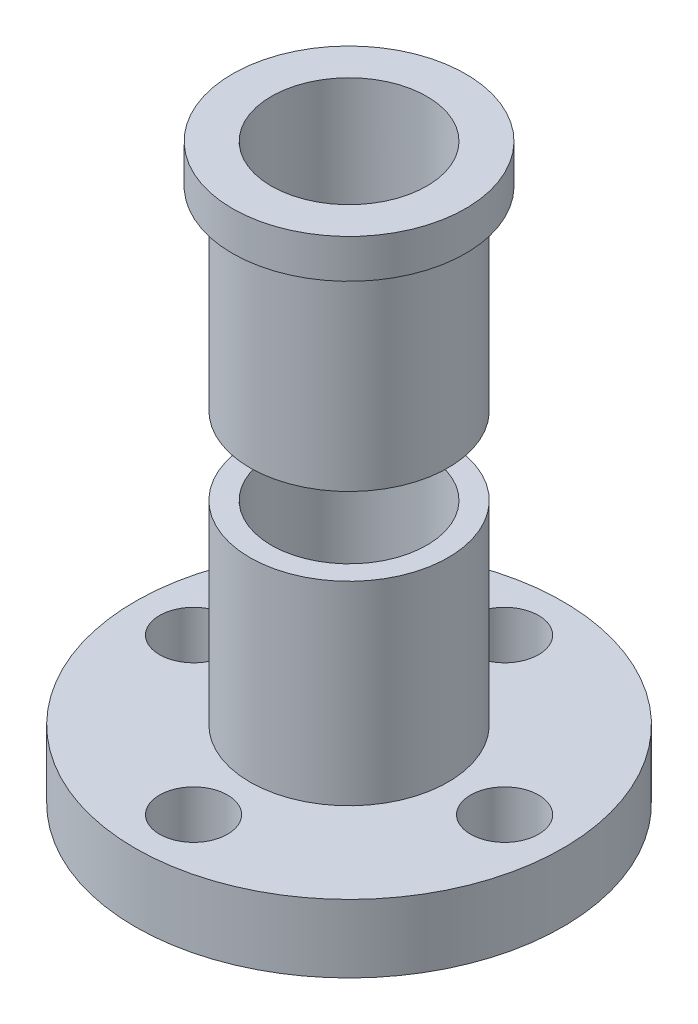
ISO-10303-21;
HEADER;
FILE_DESCRIPTION(('STEP AP214'),'2;1');
FILE_NAME('part.step','',(''),(''),'','','');
FILE_SCHEMA(('AUTOMOTIVE_DESIGN { 1 0 10303 214 1 1 1 1 }'));
ENDSEC;
DATA;
#1=APPLICATION_CONTEXT('core data for automotive mechanical design processes');
#2=APPLICATION_PROTOCOL_DEFINITION('international standard','automotive_design',2000,#1);
#3=PRODUCT_CONTEXT('',#1,'mechanical');
#4=PRODUCT('Part','Part','',(#3));
#5=PRODUCT_RELATED_PRODUCT_CATEGORY('part','',(#4));
#6=PRODUCT_DEFINITION_FORMATION('','',#4);
#7=PRODUCT_DEFINITION_CONTEXT('part definition',#1,'design');
#8=PRODUCT_DEFINITION('design','',#6,#7);
#9=PRODUCT_DEFINITION_SHAPE('','',#8);
#10=(LENGTH_UNIT() NAMED_UNIT(*) SI_UNIT(.MILLI.,.METRE.));
#11=(NAMED_UNIT(*) PLANE_ANGLE_UNIT() SI_UNIT($,.RADIAN.));
#12=(NAMED_UNIT(*) SI_UNIT($,.STERADIAN.) SOLID_ANGLE_UNIT());
#13=UNCERTAINTY_MEASURE_WITH_UNIT(LENGTH_MEASURE(1.E-05),#10,'distance_accuracy_value','');
#14=(GEOMETRIC_REPRESENTATION_CONTEXT(3) GLOBAL_UNCERTAINTY_ASSIGNED_CONTEXT((#13)) GLOBAL_UNIT_ASSIGNED_CONTEXT((#10,
#11,#12)) REPRESENTATION_CONTEXT('',''));
#15=CARTESIAN_POINT('',(0.,0.,0.));
#16=DIRECTION('',(0.,0.,1.));
#17=DIRECTION('',(1.,0.,0.));
#18=AXIS2_PLACEMENT_3D('',#15,#16,#17);
#19=CARTESIAN_POINT('',(0.,15.,0.));
#20=DIRECTION('',(0.,-1.,0.));
#21=DIRECTION('',(0.,0.,-1.));
#22=AXIS2_PLACEMENT_3D('',#19,#20,#21);
#23=CYLINDRICAL_SURFACE('',#22,11.);
#24=CARTESIAN_POINT('',(0.,1.5,0.));
#25=DIRECTION('',(0.,1.,0.));
#26=DIRECTION('',(0.,0.,1.));
#27=AXIS2_PLACEMENT_3D('',#24,#25,#26);
#28=CIRCLE('',#27,11.);
#29=CARTESIAN_POINT('',(0.,1.5,11.));
#30=VERTEX_POINT('',#29);
#31=EDGE_CURVE('P0_E27',#30,#30,#28,.T.);
#32=ORIENTED_EDGE('',*,*,#31,.T.);
#33=EDGE_LOOP('',(#32));
#34=FACE_BOUND('',#33,.T.);
#35=CARTESIAN_POINT('',(0.,5.,0.));
#36=DIRECTION('',(0.,1.,0.));
#37=DIRECTION('',(0.,0.,1.));
#38=AXIS2_PLACEMENT_3D('',#35,#36,#37);
#39=CIRCLE('',#38,11.);
#40=CARTESIAN_POINT('',(0.,5.,11.));
#41=VERTEX_POINT('',#40);
#42=EDGE_CURVE('P0_E18',#41,#41,#39,.T.);
#43=ORIENTED_EDGE('',*,*,#42,.F.);
#44=EDGE_LOOP('',(#43));
#45=FACE_BOUND('',#44,.T.);
#46=ADVANCED_FACE('P0_F15',(#34,#45),#23,.T.);
#47=CARTESIAN_POINT('',(0.,15.,0.));
#48=DIRECTION('',(0.,1.,0.));
#49=DIRECTION('',(0.,0.,1.));
#50=AXIS2_PLACEMENT_3D('',#47,#48,#49);
#51=PLANE('',#50);
#52=CARTESIAN_POINT('',(0.,15.,0.));
#53=DIRECTION('',(0.,1.,0.));
#54=DIRECTION('',(0.,0.,1.));
#55=AXIS2_PLACEMENT_3D('',#52,#53,#54);
#56=CIRCLE('',#55,5.1);
#57=CARTESIAN_POINT('',(0.,15.,5.1));
#58=VERTEX_POINT('',#57);
#59=EDGE_CURVE('P0_E44',#58,#58,#56,.T.);
#60=ORIENTED_EDGE('',*,*,#59,.T.);
#61=EDGE_LOOP('',(#60));
#62=FACE_BOUND('',#61,.T.);
#63=CARTESIAN_POINT('',(0.,15.,0.));
#64=DIRECTION('',(0.,1.,0.));
#65=DIRECTION('',(0.,0.,1.));
#66=AXIS2_PLACEMENT_3D('',#63,#64,#65);
#67=CIRCLE('',#66,4.);
#68=CARTESIAN_POINT('',(0.,15.,4.));
#69=VERTEX_POINT('',#68);
#70=EDGE_CURVE('P0_E10',#69,#69,#67,.T.);
#71=ORIENTED_EDGE('',*,*,#70,.F.);
#72=EDGE_LOOP('',(#71));
#73=FACE_BOUND('',#72,.T.);
#74=ADVANCED_FACE('P0_F93',(#62,#73),#51,.T.);
#75=CARTESIAN_POINT('',(0.,0.,0.));
#76=DIRECTION('',(0.,1.,0.));
#77=DIRECTION('',(0.,0.,1.));
#78=AXIS2_PLACEMENT_3D('',#75,#76,#77);
#79=PLANE('',#78);
#80=CARTESIAN_POINT('',(0.,0.,0.));
#81=DIRECTION('',(0.,1.,0.));
#82=DIRECTION('',(0.,0.,1.));
#83=AXIS2_PLACEMENT_3D('',#80,#81,#82);
#84=CIRCLE('',#83,5.1);
#85=CARTESIAN_POINT('',(0.,0.,5.1));
#86=VERTEX_POINT('',#85);
#87=EDGE_CURVE('P0_E30',#86,#86,#84,.T.);
#88=ORIENTED_EDGE('',*,*,#87,.F.);
#89=EDGE_LOOP('',(#88));
#90=FACE_BOUND('',#89,.T.);
#91=CARTESIAN_POINT('',(0.,0.,0.));
#92=DIRECTION('',(0.,1.,0.));
#93=DIRECTION('',(0.,0.,1.));
#94=AXIS2_PLACEMENT_3D('',#91,#92,#93);
#95=CIRCLE('',#94,4.);
#96=CARTESIAN_POINT('',(0.,0.,4.));
#97=VERTEX_POINT('',#96);
#98=EDGE_CURVE('P0_E22',#97,#97,#95,.T.);
#99=ORIENTED_EDGE('',*,*,#98,.T.);
#100=EDGE_LOOP('',(#99));
#101=FACE_BOUND('',#100,.T.);
#102=ADVANCED_FACE('P0_F98',(#90,#101),#79,.F.);
#103=CARTESIAN_POINT('',(0.,15.,0.));
#104=DIRECTION('',(0.,-1.,0.));
#105=DIRECTION('',(0.,0.,-1.));
#106=AXIS2_PLACEMENT_3D('',#103,#104,#105);
#107=CYLINDRICAL_SURFACE('',#106,4.);
#108=ORIENTED_EDGE('',*,*,#70,.T.);
#109=EDGE_LOOP('',(#108));
#110=FACE_BOUND('',#109,.T.);
#111=ORIENTED_EDGE('',*,*,#98,.F.);
#112=EDGE_LOOP('',(#111));
#113=FACE_BOUND('',#112,.T.);
#114=ADVANCED_FACE('P0_F104',(#110,#113),#107,.F.);
#115=CARTESIAN_POINT('',(0.,1.5,0.));
#116=DIRECTION('',(0.,1.,0.));
#117=DIRECTION('',(0.,0.,1.));
#118=AXIS2_PLACEMENT_3D('',#115,#116,#117);
#119=PLANE('',#118);
#120=CARTESIAN_POINT('',(0.,1.5,-8.));
#121=DIRECTION('',(0.,1.,0.));
#122=DIRECTION('',(0.,0.,1.));
#123=AXIS2_PLACEMENT_3D('',#120,#121,#122);
#124=CIRCLE('',#123,1.75);
#125=CARTESIAN_POINT('',(0.,1.5,-6.25));
#126=VERTEX_POINT('',#125);
#127=EDGE_CURVE('P0_E65',#126,#126,#124,.T.);
#128=ORIENTED_EDGE('',*,*,#127,.T.);
#129=EDGE_LOOP('',(#128));
#130=FACE_BOUND('',#129,.T.);
#131=CARTESIAN_POINT('',(8.,1.5,0.));
#132=DIRECTION('',(0.,1.,0.));
#133=DIRECTION('',(0.,0.,1.));
#134=AXIS2_PLACEMENT_3D('',#131,#132,#133);
#135=CIRCLE('',#134,1.75);
#136=CARTESIAN_POINT('',(8.,1.5,1.75));
#137=VERTEX_POINT('',#136);
#138=EDGE_CURVE('P0_E59',#137,#137,#135,.T.);
#139=ORIENTED_EDGE('',*,*,#138,.T.);
#140=EDGE_LOOP('',(#139));
#141=FACE_BOUND('',#140,.T.);
#142=CARTESIAN_POINT('',(0.,1.5,8.));
#143=DIRECTION('',(0.,1.,0.));
#144=DIRECTION('',(0.,0.,1.));
#145=AXIS2_PLACEMENT_3D('',#142,#143,#144);
#146=CIRCLE('',#145,1.75);
#147=CARTESIAN_POINT('',(0.,1.5,9.75));
#148=VERTEX_POINT('',#147);
#149=EDGE_CURVE('P0_E53',#148,#148,#146,.T.);
#150=ORIENTED_EDGE('',*,*,#149,.T.);
#151=EDGE_LOOP('',(#150));
#152=FACE_BOUND('',#151,.T.);
#153=CARTESIAN_POINT('',(-8.,1.5,0.));
#154=DIRECTION('',(0.,1.,0.));
#155=DIRECTION('',(0.,0.,1.));
#156=AXIS2_PLACEMENT_3D('',#153,#154,#155);
#157=CIRCLE('',#156,1.75);
#158=CARTESIAN_POINT('',(-8.,1.5,1.75));
#159=VERTEX_POINT('',#158);
#160=EDGE_CURVE('P0_E45',#159,#159,#157,.T.);
#161=ORIENTED_EDGE('',*,*,#160,.T.);
#162=EDGE_LOOP('',(#161));
#163=FACE_BOUND('',#162,.T.);
#164=CARTESIAN_POINT('',(0.,1.5,0.));
#165=DIRECTION('',(0.,1.,0.));
#166=DIRECTION('',(0.,0.,1.));
#167=AXIS2_PLACEMENT_3D('',#164,#165,#166);
#168=CIRCLE('',#167,5.1);
#169=CARTESIAN_POINT('',(0.,1.5,5.1));
#170=VERTEX_POINT('',#169);
#171=EDGE_CURVE('P0_E33',#170,#170,#168,.T.);
#172=ORIENTED_EDGE('',*,*,#171,.T.);
#173=EDGE_LOOP('',(#172));
#174=FACE_BOUND('',#173,.T.);
#175=ORIENTED_EDGE('',*,*,#31,.F.);
#176=EDGE_LOOP('',(#175));
#177=FACE_BOUND('',#176,.T.);
#178=ADVANCED_FACE('P0_F110',(#130,#141,#152,#163,#174,#177),#119,.F.);
#179=CARTESIAN_POINT('',(0.,1.5,0.));
#180=DIRECTION('',(0.,-1.,0.));
#181=DIRECTION('',(0.,0.,-1.));
#182=AXIS2_PLACEMENT_3D('',#179,#180,#181);
#183=CYLINDRICAL_SURFACE('',#182,5.1);
#184=ORIENTED_EDGE('',*,*,#171,.F.);
#185=EDGE_LOOP('',(#184));
#186=FACE_BOUND('',#185,.T.);
#187=ORIENTED_EDGE('',*,*,#87,.T.);
#188=EDGE_LOOP('',(#187));
#189=FACE_BOUND('',#188,.T.);
#190=ADVANCED_FACE('P0_F79',(#186,#189),#183,.T.);
#191=CARTESIAN_POINT('',(0.,5.,0.));
#192=DIRECTION('',(0.,1.,0.));
#193=DIRECTION('',(0.,0.,1.));
#194=AXIS2_PLACEMENT_3D('',#191,#192,#193);
#195=PLANE('',#194);
#196=CARTESIAN_POINT('',(0.,5.,-8.));
#197=DIRECTION('',(0.,1.,0.));
#198=DIRECTION('',(0.,0.,1.));
#199=AXIS2_PLACEMENT_3D('',#196,#197,#198);
#200=CIRCLE('',#199,1.75);
#201=CARTESIAN_POINT('',(0.,5.,-6.25));
#202=VERTEX_POINT('',#201);
#203=EDGE_CURVE('P0_E68',#202,#202,#200,.T.);
#204=ORIENTED_EDGE('',*,*,#203,.F.);
#205=EDGE_LOOP('',(#204));
#206=FACE_BOUND('',#205,.T.);
#207=CARTESIAN_POINT('',(8.,5.,0.));
#208=DIRECTION('',(0.,1.,0.));
#209=DIRECTION('',(0.,0.,1.));
#210=AXIS2_PLACEMENT_3D('',#207,#208,#209);
#211=CIRCLE('',#210,1.75);
#212=CARTESIAN_POINT('',(8.,5.,1.75));
#213=VERTEX_POINT('',#212);
#214=EDGE_CURVE('P0_E62',#213,#213,#211,.T.);
#215=ORIENTED_EDGE('',*,*,#214,.F.);
#216=EDGE_LOOP('',(#215));
#217=FACE_BOUND('',#216,.T.);
#218=CARTESIAN_POINT('',(0.,5.,8.));
#219=DIRECTION('',(0.,1.,0.));
#220=DIRECTION('',(0.,0.,1.));
#221=AXIS2_PLACEMENT_3D('',#218,#219,#220);
#222=CIRCLE('',#221,1.75);
#223=CARTESIAN_POINT('',(0.,5.,9.75));
#224=VERTEX_POINT('',#223);
#225=EDGE_CURVE('P0_E56',#224,#224,#222,.T.);
#226=ORIENTED_EDGE('',*,*,#225,.F.);
#227=EDGE_LOOP('',(#226));
#228=FACE_BOUND('',#227,.T.);
#229=CARTESIAN_POINT('',(-8.,5.,0.));
#230=DIRECTION('',(0.,1.,0.));
#231=DIRECTION('',(0.,0.,1.));
#232=AXIS2_PLACEMENT_3D('',#229,#230,#231);
#233=CIRCLE('',#232,1.75);
#234=CARTESIAN_POINT('',(-8.,5.,1.75));
#235=VERTEX_POINT('',#234);
#236=EDGE_CURVE('P0_E50',#235,#235,#233,.T.);
#237=ORIENTED_EDGE('',*,*,#236,.F.);
#238=EDGE_LOOP('',(#237));
#239=FACE_BOUND('',#238,.T.);
#240=CARTESIAN_POINT('',(0.,5.,0.));
#241=DIRECTION('',(0.,1.,0.));
#242=DIRECTION('',(0.,0.,1.));
#243=AXIS2_PLACEMENT_3D('',#240,#241,#242);
#244=CIRCLE('',#243,5.1);
#245=CARTESIAN_POINT('',(0.,5.,5.1));
#246=VERTEX_POINT('',#245);
#247=EDGE_CURVE('P0_E41',#246,#246,#244,.T.);
#248=ORIENTED_EDGE('',*,*,#247,.F.);
#249=EDGE_LOOP('',(#248));
#250=FACE_BOUND('',#249,.T.);
#251=ORIENTED_EDGE('',*,*,#42,.T.);
#252=EDGE_LOOP('',(#251));
#253=FACE_BOUND('',#252,.T.);
#254=ADVANCED_FACE('P0_F75',(#206,#217,#228,#239,#250,#253),#195,.T.);
#255=CARTESIAN_POINT('',(0.,15.,0.));
#256=DIRECTION('',(0.,-1.,0.));
#257=DIRECTION('',(0.,0.,-1.));
#258=AXIS2_PLACEMENT_3D('',#255,#256,#257);
#259=CYLINDRICAL_SURFACE('',#258,5.1);
#260=ORIENTED_EDGE('',*,*,#59,.F.);
#261=EDGE_LOOP('',(#260));
#262=FACE_BOUND('',#261,.T.);
#263=ORIENTED_EDGE('',*,*,#247,.T.);
#264=EDGE_LOOP('',(#263));
#265=FACE_BOUND('',#264,.T.);
#266=ADVANCED_FACE('P0_F78',(#262,#265),#259,.T.);
#267=CARTESIAN_POINT('',(-8.,5.,0.));
#268=DIRECTION('',(0.,1.,0.));
#269=DIRECTION('',(0.,0.,1.));
#270=AXIS2_PLACEMENT_3D('',#267,#268,#269);
#271=CYLINDRICAL_SURFACE('',#270,1.75);
#272=ORIENTED_EDGE('',*,*,#236,.T.);
#273=EDGE_LOOP('',(#272));
#274=FACE_BOUND('',#273,.T.);
#275=ORIENTED_EDGE('',*,*,#160,.F.);
#276=EDGE_LOOP('',(#275));
#277=FACE_BOUND('',#276,.T.);
#278=ADVANCED_FACE('P0_F119',(#274,#277),#271,.F.);
#279=CARTESIAN_POINT('',(0.,5.,8.));
#280=DIRECTION('',(0.,1.,0.));
#281=DIRECTION('',(0.,0.,1.));
#282=AXIS2_PLACEMENT_3D('',#279,#280,#281);
#283=CYLINDRICAL_SURFACE('',#282,1.75);
#284=ORIENTED_EDGE('',*,*,#225,.T.);
#285=EDGE_LOOP('',(#284));
#286=FACE_BOUND('',#285,.T.);
#287=ORIENTED_EDGE('',*,*,#149,.F.);
#288=EDGE_LOOP('',(#287));
#289=FACE_BOUND('',#288,.T.);
#290=ADVANCED_FACE('P0_F123',(#286,#289),#283,.F.);
#291=CARTESIAN_POINT('',(8.,5.,0.));
#292=DIRECTION('',(0.,1.,0.));
#293=DIRECTION('',(0.,0.,1.));
#294=AXIS2_PLACEMENT_3D('',#291,#292,#293);
#295=CYLINDRICAL_SURFACE('',#294,1.75);
#296=ORIENTED_EDGE('',*,*,#214,.T.);
#297=EDGE_LOOP('',(#296));
#298=FACE_BOUND('',#297,.T.);
#299=ORIENTED_EDGE('',*,*,#138,.F.);
#300=EDGE_LOOP('',(#299));
#301=FACE_BOUND('',#300,.T.);
#302=ADVANCED_FACE('P0_F127',(#298,#301),#295,.F.);
#303=CARTESIAN_POINT('',(0.,5.,-8.));
#304=DIRECTION('',(0.,1.,0.));
#305=DIRECTION('',(0.,0.,1.));
#306=AXIS2_PLACEMENT_3D('',#303,#304,#305);
#307=CYLINDRICAL_SURFACE('',#306,1.75);
#308=ORIENTED_EDGE('',*,*,#203,.T.);
#309=EDGE_LOOP('',(#308));
#310=FACE_BOUND('',#309,.T.);
#311=ORIENTED_EDGE('',*,*,#127,.F.);
#312=EDGE_LOOP('',(#311));
#313=FACE_BOUND('',#312,.T.);
#314=ADVANCED_FACE('P0_F72',(#310,#313),#307,.F.);
#315=CLOSED_SHELL('',(#46,#74,#102,#114,#178,#190,#254,#266,#278,#290,#302,#314));
#316=MANIFOLD_SOLID_BREP('P0_B1',#315);
#317=CARTESIAN_POINT('',(0.,29.,0.));
#318=DIRECTION('',(0.,1.,0.));
#319=DIRECTION('',(0.,0.,1.));
#320=AXIS2_PLACEMENT_3D('',#317,#318,#319);
#321=PLANE('',#320);
#322=CARTESIAN_POINT('',(0.,29.,0.));
#323=DIRECTION('',(0.,1.,0.));
#324=DIRECTION('',(0.,0.,1.));
#325=AXIS2_PLACEMENT_3D('',#322,#323,#324);
#326=CIRCLE('',#325,6.);
#327=CARTESIAN_POINT('',(0.,29.,6.));
#328=VERTEX_POINT('',#327);
#329=EDGE_CURVE('P1_E22',#328,#328,#326,.T.);
#330=ORIENTED_EDGE('',*,*,#329,.F.);
#331=EDGE_LOOP('',(#330));
#332=FACE_BOUND('',#331,.T.);
#333=CARTESIAN_POINT('',(0.,29.,0.));
#334=DIRECTION('',(0.,1.,0.));
#335=DIRECTION('',(0.,0.,1.));
#336=AXIS2_PLACEMENT_3D('',#333,#334,#335);
#337=CIRCLE('',#336,5.1);
#338=CARTESIAN_POINT('',(0.,29.,5.1));
#339=VERTEX_POINT('',#338);
#340=EDGE_CURVE('P1_E10',#339,#339,#337,.F.);
#341=ORIENTED_EDGE('',*,*,#340,.F.);
#342=EDGE_LOOP('',(#341));
#343=FACE_BOUND('',#342,.T.);
#344=ADVANCED_FACE('P1_F15',(#332,#343),#321,.F.);
#345=CARTESIAN_POINT('',(0.,29.,0.));
#346=DIRECTION('',(0.,1.,0.));
#347=DIRECTION('',(0.,0.,1.));
#348=AXIS2_PLACEMENT_3D('',#345,#346,#347);
#349=CYLINDRICAL_SURFACE('',#348,6.);
#350=ORIENTED_EDGE('',*,*,#329,.T.);
#351=EDGE_LOOP('',(#350));
#352=FACE_BOUND('',#351,.T.);
#353=CARTESIAN_POINT('',(0.,31.,0.));
#354=DIRECTION('',(0.,1.,0.));
#355=DIRECTION('',(0.,0.,1.));
#356=AXIS2_PLACEMENT_3D('',#353,#354,#355);
#357=CIRCLE('',#356,6.);
#358=CARTESIAN_POINT('',(0.,31.,6.));
#359=VERTEX_POINT('',#358);
#360=EDGE_CURVE('P1_E26',#359,#359,#357,.T.);
#361=ORIENTED_EDGE('',*,*,#360,.F.);
#362=EDGE_LOOP('',(#361));
#363=FACE_BOUND('',#362,.T.);
#364=ADVANCED_FACE('P1_F17',(#352,#363),#349,.T.);
#365=CARTESIAN_POINT('',(0.,31.,0.));
#366=DIRECTION('',(0.,1.,0.));
#367=DIRECTION('',(0.,0.,1.));
#368=AXIS2_PLACEMENT_3D('',#365,#366,#367);
#369=PLANE('',#368);
#370=CARTESIAN_POINT('',(0.,31.,0.));
#371=DIRECTION('',(0.,1.,0.));
#372=DIRECTION('',(0.,0.,1.));
#373=AXIS2_PLACEMENT_3D('',#370,#371,#372);
#374=CIRCLE('',#373,4.);
#375=CARTESIAN_POINT('',(0.,31.,4.));
#376=VERTEX_POINT('',#375);
#377=EDGE_CURVE('P1_E31',#376,#376,#374,.T.);
#378=ORIENTED_EDGE('',*,*,#377,.F.);
#379=EDGE_LOOP('',(#378));
#380=FACE_BOUND('',#379,.T.);
#381=ORIENTED_EDGE('',*,*,#360,.T.);
#382=EDGE_LOOP('',(#381));
#383=FACE_BOUND('',#382,.T.);
#384=ADVANCED_FACE('P1_F56',(#380,#383),#369,.T.);
#385=CARTESIAN_POINT('',(0.,29.,0.));
#386=DIRECTION('',(0.,1.,0.));
#387=DIRECTION('',(0.,0.,1.));
#388=AXIS2_PLACEMENT_3D('',#385,#386,#387);
#389=CYLINDRICAL_SURFACE('',#388,4.);
#390=ORIENTED_EDGE('',*,*,#377,.T.);
#391=EDGE_LOOP('',(#390));
#392=FACE_BOUND('',#391,.T.);
#393=CARTESIAN_POINT('',(0.,19.,0.));
#394=DIRECTION('',(0.,-1.,0.));
#395=DIRECTION('',(0.,0.,-1.));
#396=AXIS2_PLACEMENT_3D('',#393,#394,#395);
#397=CIRCLE('',#396,4.);
#398=CARTESIAN_POINT('',(0.,19.,-4.));
#399=VERTEX_POINT('',#398);
#400=EDGE_CURVE('P1_E38',#399,#399,#397,.T.);
#401=ORIENTED_EDGE('',*,*,#400,.T.);
#402=EDGE_LOOP('',(#401));
#403=FACE_BOUND('',#402,.T.);
#404=ADVANCED_FACE('P1_F42',(#392,#403),#389,.F.);
#405=CARTESIAN_POINT('',(0.,19.,0.));
#406=DIRECTION('',(0.,-1.,0.));
#407=DIRECTION('',(0.,0.,-1.));
#408=AXIS2_PLACEMENT_3D('',#405,#406,#407);
#409=PLANE('',#408);
#410=CARTESIAN_POINT('',(0.,19.,0.));
#411=DIRECTION('',(0.,-1.,0.));
#412=DIRECTION('',(0.,0.,-1.));
#413=AXIS2_PLACEMENT_3D('',#410,#411,#412);
#414=CIRCLE('',#413,5.1);
#415=CARTESIAN_POINT('',(0.,19.,-5.1));
#416=VERTEX_POINT('',#415);
#417=EDGE_CURVE('P1_E35',#416,#416,#414,.T.);
#418=ORIENTED_EDGE('',*,*,#417,.T.);
#419=EDGE_LOOP('',(#418));
#420=FACE_BOUND('',#419,.T.);
#421=ORIENTED_EDGE('',*,*,#400,.F.);
#422=EDGE_LOOP('',(#421));
#423=FACE_BOUND('',#422,.T.);
#424=ADVANCED_FACE('P1_F44',(#420,#423),#409,.T.);
#425=CARTESIAN_POINT('',(0.,19.,0.));
#426=DIRECTION('',(0.,1.,0.));
#427=DIRECTION('',(0.,0.,1.));
#428=AXIS2_PLACEMENT_3D('',#425,#426,#427);
#429=CYLINDRICAL_SURFACE('',#428,5.1);
#430=ORIENTED_EDGE('',*,*,#417,.F.);
#431=EDGE_LOOP('',(#430));
#432=FACE_BOUND('',#431,.T.);
#433=ORIENTED_EDGE('',*,*,#340,.T.);
#434=EDGE_LOOP('',(#433));
#435=FACE_BOUND('',#434,.T.);
#436=ADVANCED_FACE('P1_F46',(#432,#435),#429,.T.);
#437=CLOSED_SHELL('',(#344,#364,#384,#404,#424,#436));
#438=MANIFOLD_SOLID_BREP('P1_B1',#437);
#439=ADVANCED_BREP_SHAPE_REPRESENTATION('',(#18,#316,#438),#14);
#440=SHAPE_DEFINITION_REPRESENTATION(#9,#439);
ENDSEC;
END-ISO-10303-21;
